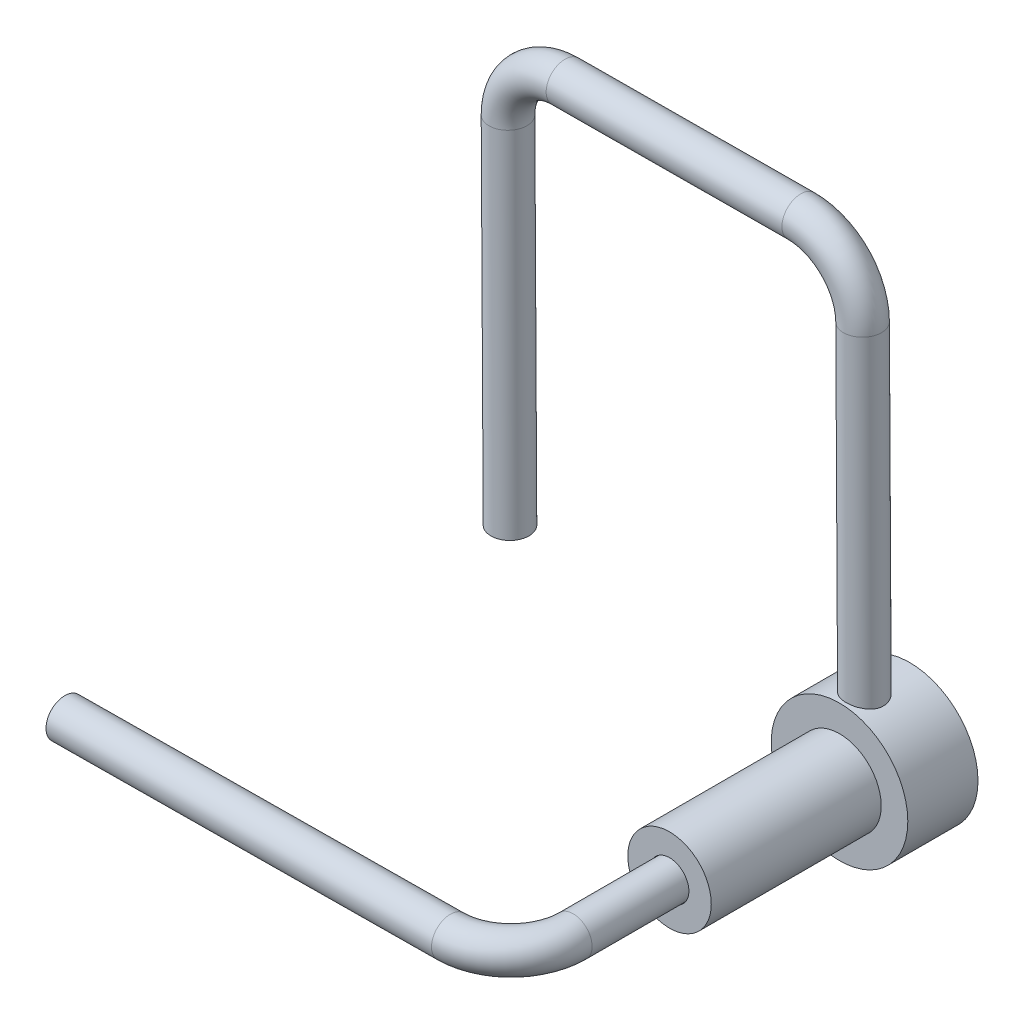
ISO-10303-21;
HEADER;
FILE_DESCRIPTION(('STEP AP214'),'2;1');
FILE_NAME('part.step','',(''),(''),'','','');
FILE_SCHEMA(('AUTOMOTIVE_DESIGN { 1 0 10303 214 1 1 1 1 }'));
ENDSEC;
DATA;
#1=APPLICATION_CONTEXT('core data for automotive mechanical design processes');
#2=APPLICATION_PROTOCOL_DEFINITION('international standard','automotive_design',2000,#1);
#3=PRODUCT_CONTEXT('',#1,'mechanical');
#4=PRODUCT('Part','Part','',(#3));
#5=PRODUCT_RELATED_PRODUCT_CATEGORY('part','',(#4));
#6=PRODUCT_DEFINITION_FORMATION('','',#4);
#7=PRODUCT_DEFINITION_CONTEXT('part definition',#1,'design');
#8=PRODUCT_DEFINITION('design','',#6,#7);
#9=PRODUCT_DEFINITION_SHAPE('','',#8);
#10=(LENGTH_UNIT() NAMED_UNIT(*) SI_UNIT(.MILLI.,.METRE.));
#11=(NAMED_UNIT(*) PLANE_ANGLE_UNIT() SI_UNIT($,.RADIAN.));
#12=(NAMED_UNIT(*) SI_UNIT($,.STERADIAN.) SOLID_ANGLE_UNIT());
#13=UNCERTAINTY_MEASURE_WITH_UNIT(LENGTH_MEASURE(1.E-05),#10,'distance_accuracy_value','');
#14=(GEOMETRIC_REPRESENTATION_CONTEXT(3) GLOBAL_UNCERTAINTY_ASSIGNED_CONTEXT((#13)) GLOBAL_UNIT_ASSIGNED_CONTEXT((#10,
#11,#12)) REPRESENTATION_CONTEXT('',''));
#15=CARTESIAN_POINT('',(0.,0.,0.));
#16=DIRECTION('',(0.,0.,1.));
#17=DIRECTION('',(1.,0.,0.));
#18=AXIS2_PLACEMENT_3D('',#15,#16,#17);
#19=CARTESIAN_POINT('',(0.,0.,0.));
#20=DIRECTION('',(0.,0.,1.));
#21=DIRECTION('',(1.,0.,0.));
#22=AXIS2_PLACEMENT_3D('',#19,#20,#21);
#23=PLANE('',#22);
#24=CARTESIAN_POINT('',(0.,0.,0.));
#25=DIRECTION('',(0.,0.,1.));
#26=DIRECTION('',(1.,0.,0.));
#27=AXIS2_PLACEMENT_3D('',#24,#25,#26);
#28=CIRCLE('',#27,2.55);
#29=CARTESIAN_POINT('',(2.55,0.,0.));
#30=VERTEX_POINT('',#29);
#31=EDGE_CURVE('E165',#30,#30,#28,.T.);
#32=ORIENTED_EDGE('',*,*,#31,.T.);
#33=EDGE_LOOP('',(#32));
#34=FACE_BOUND('',#33,.T.);
#35=CARTESIAN_POINT('',(0.,0.,0.));
#36=DIRECTION('',(0.,0.,1.));
#37=DIRECTION('',(1.,0.,0.));
#38=AXIS2_PLACEMENT_3D('',#35,#36,#37);
#39=CIRCLE('',#38,7.05);
#40=CARTESIAN_POINT('',(7.05,0.,0.));
#41=VERTEX_POINT('',#40);
#42=EDGE_CURVE('E13',#41,#41,#39,.T.);
#43=ORIENTED_EDGE('',*,*,#42,.F.);
#44=EDGE_LOOP('',(#43));
#45=FACE_BOUND('',#44,.T.);
#46=ADVANCED_FACE('F146',(#34,#45),#23,.F.);
#47=CARTESIAN_POINT('',(0.,0.,25.4));
#48=DIRECTION('',(0.,0.,-1.));
#49=DIRECTION('',(-1.,0.,0.));
#50=AXIS2_PLACEMENT_3D('',#47,#48,#49);
#51=CYLINDRICAL_SURFACE('',#50,2.55);
#52=CARTESIAN_POINT('',(0.,0.,25.4));
#53=DIRECTION('',(0.,0.,1.));
#54=DIRECTION('',(1.,0.,0.));
#55=AXIS2_PLACEMENT_3D('',#52,#53,#54);
#56=CIRCLE('',#55,2.55);
#57=CARTESIAN_POINT('',(2.55,0.,25.4));
#58=VERTEX_POINT('',#57);
#59=EDGE_CURVE('E159',#58,#58,#56,.T.);
#60=ORIENTED_EDGE('',*,*,#59,.T.);
#61=EDGE_LOOP('',(#60));
#62=FACE_BOUND('',#61,.T.);
#63=ORIENTED_EDGE('',*,*,#31,.F.);
#64=EDGE_LOOP('',(#63));
#65=FACE_BOUND('',#64,.T.);
#66=ADVANCED_FACE('F148',(#62,#65),#51,.F.);
#67=CARTESIAN_POINT('',(0.,0.,25.4));
#68=DIRECTION('',(0.,0.,-1.));
#69=DIRECTION('',(-1.,0.,0.));
#70=AXIS2_PLACEMENT_3D('',#67,#68,#69);
#71=CYLINDRICAL_SURFACE('',#70,5.5);
#72=CARTESIAN_POINT('',(0.,0.,3.));
#73=DIRECTION('',(0.,0.,1.));
#74=DIRECTION('',(1.,0.,0.));
#75=AXIS2_PLACEMENT_3D('',#72,#73,#74);
#76=CIRCLE('',#75,5.5);
#77=CARTESIAN_POINT('',(5.5,0.,3.));
#78=VERTEX_POINT('',#77);
#79=EDGE_CURVE('E175',#78,#78,#76,.T.);
#80=ORIENTED_EDGE('',*,*,#79,.T.);
#81=EDGE_LOOP('',(#80));
#82=FACE_BOUND('',#81,.T.);
#83=CARTESIAN_POINT('',(0.,0.,25.4));
#84=DIRECTION('',(0.,0.,1.));
#85=DIRECTION('',(1.,0.,0.));
#86=AXIS2_PLACEMENT_3D('',#83,#84,#85);
#87=CIRCLE('',#86,5.5);
#88=CARTESIAN_POINT('',(5.5,0.,25.4));
#89=VERTEX_POINT('',#88);
#90=EDGE_CURVE('E154',#89,#89,#87,.T.);
#91=ORIENTED_EDGE('',*,*,#90,.F.);
#92=EDGE_LOOP('',(#91));
#93=FACE_BOUND('',#92,.T.);
#94=ADVANCED_FACE('F211',(#82,#93),#71,.T.);
#95=CARTESIAN_POINT('',(0.,0.,25.4));
#96=DIRECTION('',(0.,0.,1.));
#97=DIRECTION('',(1.,0.,0.));
#98=AXIS2_PLACEMENT_3D('',#95,#96,#97);
#99=PLANE('',#98);
#100=ORIENTED_EDGE('',*,*,#59,.F.);
#101=EDGE_LOOP('',(#100));
#102=FACE_BOUND('',#101,.T.);
#103=ORIENTED_EDGE('',*,*,#90,.T.);
#104=EDGE_LOOP('',(#103));
#105=FACE_BOUND('',#104,.T.);
#106=ADVANCED_FACE('F215',(#102,#105),#99,.T.);
#107=CARTESIAN_POINT('',(0.,0.,3.));
#108=DIRECTION('',(0.,0.,-1.));
#109=DIRECTION('',(-1.,0.,0.));
#110=AXIS2_PLACEMENT_3D('',#107,#108,#109);
#111=CYLINDRICAL_SURFACE('',#110,9.);
#112=CARTESIAN_POINT('',(0.,0.,3.));
#113=DIRECTION('',(0.,0.,1.));
#114=DIRECTION('',(1.,0.,0.));
#115=AXIS2_PLACEMENT_3D('',#112,#113,#114);
#116=CIRCLE('',#115,9.);
#117=CARTESIAN_POINT('',(9.,0.,3.));
#118=VERTEX_POINT('',#117);
#119=EDGE_CURVE('E170',#118,#118,#116,.T.);
#120=ORIENTED_EDGE('',*,*,#119,.F.);
#121=EDGE_LOOP('',(#120));
#122=FACE_BOUND('',#121,.T.);
#123=CARTESIAN_POINT('',(0.,0.,-6.25));
#124=DIRECTION('',(0.,0.,1.));
#125=DIRECTION('',(1.,0.,0.));
#126=AXIS2_PLACEMENT_3D('',#123,#124,#125);
#127=CIRCLE('',#126,9.);
#128=CARTESIAN_POINT('',(9.,0.,-6.25));
#129=VERTEX_POINT('',#128);
#130=EDGE_CURVE('E180',#129,#129,#127,.T.);
#131=ORIENTED_EDGE('',*,*,#130,.T.);
#132=EDGE_LOOP('',(#131));
#133=FACE_BOUND('',#132,.T.);
#134=ADVANCED_FACE('F203',(#122,#133),#111,.T.);
#135=CARTESIAN_POINT('',(0.,0.,3.));
#136=DIRECTION('',(0.,0.,1.));
#137=DIRECTION('',(1.,0.,0.));
#138=AXIS2_PLACEMENT_3D('',#135,#136,#137);
#139=PLANE('',#138);
#140=ORIENTED_EDGE('',*,*,#79,.F.);
#141=EDGE_LOOP('',(#140));
#142=FACE_BOUND('',#141,.T.);
#143=ORIENTED_EDGE('',*,*,#119,.T.);
#144=EDGE_LOOP('',(#143));
#145=FACE_BOUND('',#144,.T.);
#146=ADVANCED_FACE('F196',(#142,#145),#139,.T.);
#147=CARTESIAN_POINT('',(0.,0.,-6.25));
#148=DIRECTION('',(0.,0.,1.));
#149=DIRECTION('',(1.,0.,0.));
#150=AXIS2_PLACEMENT_3D('',#147,#148,#149);
#151=CYLINDRICAL_SURFACE('',#150,7.05);
#152=CARTESIAN_POINT('',(0.,0.,-6.25));
#153=DIRECTION('',(0.,0.,1.));
#154=DIRECTION('',(1.,0.,0.));
#155=AXIS2_PLACEMENT_3D('',#152,#153,#154);
#156=CIRCLE('',#155,7.05);
#157=CARTESIAN_POINT('',(7.05,0.,-6.25));
#158=VERTEX_POINT('',#157);
#159=EDGE_CURVE('E186',#158,#158,#156,.T.);
#160=ORIENTED_EDGE('',*,*,#159,.F.);
#161=EDGE_LOOP('',(#160));
#162=FACE_BOUND('',#161,.T.);
#163=ORIENTED_EDGE('',*,*,#42,.T.);
#164=EDGE_LOOP('',(#163));
#165=FACE_BOUND('',#164,.T.);
#166=ADVANCED_FACE('F194',(#162,#165),#151,.F.);
#167=CARTESIAN_POINT('',(0.,0.,-6.25));
#168=DIRECTION('',(0.,0.,1.));
#169=DIRECTION('',(1.,0.,0.));
#170=AXIS2_PLACEMENT_3D('',#167,#168,#169);
#171=PLANE('',#170);
#172=ORIENTED_EDGE('',*,*,#159,.T.);
#173=EDGE_LOOP('',(#172));
#174=FACE_BOUND('',#173,.T.);
#175=ORIENTED_EDGE('',*,*,#130,.F.);
#176=EDGE_LOOP('',(#175));
#177=FACE_BOUND('',#176,.T.);
#178=ADVANCED_FACE('F191',(#174,#177),#171,.F.);
#179=CLOSED_SHELL('',(#46,#66,#94,#106,#134,#146,#166,#178));
#180=MANIFOLD_SOLID_BREP('B2',#179);
#181=CARTESIAN_POINT('',(0.,0.,101.6));
#182=DIRECTION('',(0.,0.,-1.));
#183=DIRECTION('',(-1.,0.,0.));
#184=AXIS2_PLACEMENT_3D('',#181,#182,#183);
#185=CYLINDRICAL_SURFACE('',#184,2.5);
#186=CARTESIAN_POINT('',(0.,0.,0.));
#187=DIRECTION('',(0.,0.,1.));
#188=DIRECTION('',(1.,0.,0.));
#189=AXIS2_PLACEMENT_3D('',#186,#187,#188);
#190=CIRCLE('',#189,2.5);
#191=CARTESIAN_POINT('',(2.5,0.,0.));
#192=VERTEX_POINT('',#191);
#193=EDGE_CURVE('E308',#192,#192,#190,.T.);
#194=ORIENTED_EDGE('',*,*,#193,.T.);
#195=EDGE_LOOP('',(#194));
#196=FACE_BOUND('',#195,.T.);
#197=CARTESIAN_POINT('',(0.,0.,38.1));
#198=DIRECTION('',(0.,0.,1.));
#199=DIRECTION('',(1.,0.,0.));
#200=AXIS2_PLACEMENT_3D('',#197,#198,#199);
#201=CIRCLE('',#200,2.5);
#202=CARTESIAN_POINT('',(2.49990480766043,0.0218163387459008,38.1));
#203=VERTEX_POINT('',#202);
#204=EDGE_CURVE('E303',#203,#203,#201,.T.);
#205=ORIENTED_EDGE('',*,*,#204,.F.);
#206=EDGE_LOOP('',(#205));
#207=FACE_BOUND('',#206,.T.);
#208=ADVANCED_FACE('F295',(#196,#207),#185,.T.);
#209=CARTESIAN_POINT('',(-8.08476325433448,-0.0705546600400517,38.1));
#210=DIRECTION('',(0.00872653549836032,-0.999961923064171,0.));
#211=DIRECTION('',(0.999961923064171,0.00872653549836032,0.));
#212=AXIS2_PLACEMENT_3D('',#209,#210,#211);
#213=TOROIDAL_SURFACE('',#212,8.08507110906827,2.5);
#214=CARTESIAN_POINT('',(-8.08476325433451,-0.0705546600400519,46.1850711090683));
#215=DIRECTION('',(-0.999961923064171,-0.00872653549836032,0.));
#216=DIRECTION('',(7.61524218006515E-05,-0.00872620321862817,0.999961923064171));
#217=AXIS2_PLACEMENT_3D('',#214,#215,#216);
#218=CIRCLE('',#217,2.5);
#219=CARTESIAN_POINT('',(-8.08476325433451,-0.070554660040052,48.6850711090683));
#220=VERTEX_POINT('',#219);
#221=EDGE_CURVE('E145',#220,#220,#218,.T.);
#222=CARTESIAN_POINT('',(-8.08476325433448,-0.0705546600400517,38.1));
#223=DIRECTION('',(0.00872653549836032,-0.999961923064171,0.));
#224=DIRECTION('',(0.999961923064171,0.00872653549836032,0.));
#225=AXIS2_PLACEMENT_3D('',#222,#223,#224);
#226=CIRCLE('',#225,10.5850711090683);
#227=EDGE_CURVE('',#203,#220,#226,.T.);
#228=ORIENTED_EDGE('',*,*,#204,.T.);
#229=ORIENTED_EDGE('',*,*,#221,.F.);
#230=ORIENTED_EDGE('',*,*,#227,.T.);
#231=ORIENTED_EDGE('',*,*,#227,.F.);
#232=EDGE_LOOP('',(#228,#230,#229,#231));
#233=FACE_BOUND('',#232,.T.);
#234=ADVANCED_FACE('F328',(#233),#213,.T.);
#235=CARTESIAN_POINT('',(-58.8828289459944,-0.513862663356756,46.1850711090681));
#236=DIRECTION('',(0.999961923064171,0.00872653549836032,0.));
#237=DIRECTION('',(-7.61524218006515E-05,0.00872620321862817,-0.999961923064171));
#238=AXIS2_PLACEMENT_3D('',#235,#236,#237);
#239=CYLINDRICAL_SURFACE('',#238,2.5);
#240=ORIENTED_EDGE('',*,*,#221,.T.);
#241=EDGE_LOOP('',(#240));
#242=FACE_BOUND('',#241,.T.);
#243=CARTESIAN_POINT('',(-58.8828289459944,-0.513862663356756,46.1850711090681));
#244=DIRECTION('',(-0.999961923064171,-0.00872653549836032,0.));
#245=DIRECTION('',(7.61524218006515E-05,-0.00872620321862817,0.999961923064171));
#246=AXIS2_PLACEMENT_3D('',#243,#244,#245);
#247=CIRCLE('',#246,2.5);
#248=CARTESIAN_POINT('',(-58.8826385649399,-0.535678171403326,48.6849759167285));
#249=VERTEX_POINT('',#248);
#250=EDGE_CURVE('E311',#249,#249,#247,.T.);
#251=ORIENTED_EDGE('',*,*,#250,.F.);
#252=EDGE_LOOP('',(#251));
#253=FACE_BOUND('',#252,.T.);
#254=ADVANCED_FACE('F325',(#242,#253),#239,.T.);
#255=CARTESIAN_POINT('',(-58.8828289459944,-0.513862663356756,46.1850711090681));
#256=DIRECTION('',(-0.999961923064171,-0.00872653549836032,0.));
#257=DIRECTION('',(7.61524218006515E-05,-0.00872620321862817,0.999961923064171));
#258=AXIS2_PLACEMENT_3D('',#255,#256,#257);
#259=PLANE('',#258);
#260=ORIENTED_EDGE('',*,*,#250,.T.);
#261=EDGE_LOOP('',(#260));
#262=FACE_BOUND('',#261,.T.);
#263=ADVANCED_FACE('F321',(#262),#259,.T.);
#264=CARTESIAN_POINT('',(0.,0.,0.));
#265=DIRECTION('',(0.,0.,1.));
#266=DIRECTION('',(1.,0.,0.));
#267=AXIS2_PLACEMENT_3D('',#264,#265,#266);
#268=PLANE('',#267);
#269=ORIENTED_EDGE('',*,*,#193,.F.);
#270=EDGE_LOOP('',(#269));
#271=FACE_BOUND('',#270,.T.);
#272=ADVANCED_FACE('F297',(#271),#268,.F.);
#273=CLOSED_SHELL('',(#208,#234,#254,#263,#272));
#274=MANIFOLD_SOLID_BREP('B8_NOT_SHOWN',#273);
#275=CARTESIAN_POINT('',(-46.420753356991,4.59161939468769,-1.76544371842712E-13));
#276=DIRECTION('',(-0.00563734568943531,0.999984110040543,0.));
#277=DIRECTION('',(0.,0.,-1.));
#278=AXIS2_PLACEMENT_3D('',#275,#276,#277);
#279=CYLINDRICAL_SURFACE('',#278,2.5);
#280=CARTESIAN_POINT('',(-46.6839243014587,51.2743628683252,0.));
#281=DIRECTION('',(-0.00563734568943116,0.999984110040544,0.));
#282=DIRECTION('',(0.,0.,-1.));
#283=AXIS2_PLACEMENT_3D('',#280,#281,#282);
#284=CIRCLE('',#283,2.5);
#285=CARTESIAN_POINT('',(-46.6839243014588,51.2743628683252,-2.50000000000001));
#286=VERTEX_POINT('',#285);
#287=EDGE_CURVE('E294',#286,#286,#284,.T.);
#288=ORIENTED_EDGE('',*,*,#287,.F.);
#289=EDGE_LOOP('',(#288));
#290=FACE_BOUND('',#289,.T.);
#291=CARTESIAN_POINT('',(-46.420753356991,4.59161939468769,-1.76544371842712E-13));
#292=DIRECTION('',(0.00563734568943531,-0.999984110040544,0.));
#293=DIRECTION('',(0.,0.,1.));
#294=AXIS2_PLACEMENT_3D('',#291,#292,#293);
#295=CIRCLE('',#294,2.5);
#296=CARTESIAN_POINT('',(-46.420753356991,4.59161939468768,2.49999999999982));
#297=VERTEX_POINT('',#296);
#298=EDGE_CURVE('E397',#297,#297,#295,.T.);
#299=ORIENTED_EDGE('',*,*,#298,.F.);
#300=EDGE_LOOP('',(#299));
#301=FACE_BOUND('',#300,.T.);
#302=ADVANCED_FACE('F369',(#290,#301),#279,.T.);
#303=CARTESIAN_POINT('',(-8.04265016746616,50.9751657825808,0.));
#304=DIRECTION('',(0.,0.,1.));
#305=DIRECTION('',(0.999984110040544,0.00563734568942783,0.));
#306=AXIS2_PLACEMENT_3D('',#303,#304,#305);
#307=TOROIDAL_SURFACE('',#306,8.08507110906829,2.5);
#308=CARTESIAN_POINT('',(-8.08822850823162,59.0601084201969,0.));
#309=DIRECTION('',(-0.999984110040544,-0.00563734568943199,0.));
#310=DIRECTION('',(0.,0.,1.));
#311=AXIS2_PLACEMENT_3D('',#308,#309,#310);
#312=CIRCLE('',#311,2.5);
#313=CARTESIAN_POINT('',(-8.08822850823162,59.0601084201969,2.5));
#314=VERTEX_POINT('',#313);
#315=EDGE_CURVE('E382',#314,#314,#312,.T.);
#316=ORIENTED_EDGE('',*,*,#315,.F.);
#317=EDGE_LOOP('',(#316));
#318=FACE_BOUND('',#317,.T.);
#319=CARTESIAN_POINT('',(0.0422924701500044,51.0207441233462,0.));
#320=DIRECTION('',(-0.00563734568942783,0.999984110040544,0.));
#321=DIRECTION('',(0.,0.,1.));
#322=AXIS2_PLACEMENT_3D('',#319,#320,#321);
#323=CIRCLE('',#322,2.5);
#324=CARTESIAN_POINT('',(0.0422924701500042,51.0207441233462,-2.5));
#325=VERTEX_POINT('',#324);
#326=EDGE_CURVE('E394',#325,#325,#323,.T.);
#327=ORIENTED_EDGE('',*,*,#326,.T.);
#328=EDGE_LOOP('',(#327));
#329=FACE_BOUND('',#328,.T.);
#330=ADVANCED_FACE('F409',(#318,#329),#307,.T.);
#331=CARTESIAN_POINT('',(-0.530461851895863,152.619129703465,0.));
#332=DIRECTION('',(0.00563734568942783,-0.999984110040543,0.));
#333=DIRECTION('',(0.,0.,-1.));
#334=AXIS2_PLACEMENT_3D('',#331,#332,#333);
#335=CYLINDRICAL_SURFACE('',#334,2.5);
#336=CARTESIAN_POINT('',(0.328669631172938,0.221551333286567,0.));
#337=DIRECTION('',(-0.00563734568942783,0.999984110040544,0.));
#338=DIRECTION('',(0.,0.,1.));
#339=AXIS2_PLACEMENT_3D('',#336,#337,#338);
#340=CIRCLE('',#339,2.5);
#341=CARTESIAN_POINT('',(0.328669631172938,0.221551333286552,-2.5));
#342=VERTEX_POINT('',#341);
#343=EDGE_CURVE('E391',#342,#342,#340,.T.);
#344=CARTESIAN_POINT('',(0.328669631172938,0.221551333286552,-2.5));
#345=CARTESIAN_POINT('',(0.325686535745616,0.750709591516342,-2.5));
#346=CARTESIAN_POINT('',(0.322703440318294,1.27986784974613,-2.5));
#347=CARTESIAN_POINT('',(0.316737249463649,2.33818436620572,-2.5));
#348=CARTESIAN_POINT('',(0.313754154036327,2.86734262443551,-2.5));
#349=CARTESIAN_POINT('',(0.307787963181683,3.92565914089508,-2.5));
#350=CARTESIAN_POINT('',(0.30480486775436,4.45481739912486,-2.5));
#351=CARTESIAN_POINT('',(0.298838676899716,5.51313391558444,-2.5));
#352=CARTESIAN_POINT('',(0.295855581472394,6.04229217381423,-2.5));
#353=CARTESIAN_POINT('',(0.289889390617749,7.10060869027381,-2.5));
#354=CARTESIAN_POINT('',(0.286906295190427,7.6297669485036,-2.5));
#355=CARTESIAN_POINT('',(0.280940104335783,8.68808346496317,-2.5));
#356=CARTESIAN_POINT('',(0.27795700890846,9.21724172319296,-2.5));
#357=CARTESIAN_POINT('',(0.271990818053816,10.2755582396525,-2.5));
#358=CARTESIAN_POINT('',(0.269007722626494,10.8047164978823,-2.5));
#359=CARTESIAN_POINT('',(0.263041531771849,11.8630330143419,-2.5));
#360=CARTESIAN_POINT('',(0.260058436344527,12.3921912725717,-2.5));
#361=CARTESIAN_POINT('',(0.254092245489882,13.4505077890313,-2.5));
#362=CARTESIAN_POINT('',(0.25110915006256,13.979666047261,-2.5));
#363=CARTESIAN_POINT('',(0.245142959207916,15.0379825637206,-2.5));
#364=CARTESIAN_POINT('',(0.242159863780594,15.5671408219504,-2.5));
#365=CARTESIAN_POINT('',(0.236193672925949,16.62545733841,-2.5));
#366=CARTESIAN_POINT('',(0.233210577498627,17.1546155966398,-2.5));
#367=CARTESIAN_POINT('',(0.227244386643982,18.2129321130994,-2.5));
#368=CARTESIAN_POINT('',(0.22426129121666,18.7420903713291,-2.5));
#369=CARTESIAN_POINT('',(0.218295100362016,19.8004068877887,-2.5));
#370=CARTESIAN_POINT('',(0.215312004934693,20.3295651460185,-2.5));
#371=CARTESIAN_POINT('',(0.209345814080049,21.3878816624781,-2.5));
#372=CARTESIAN_POINT('',(0.206362718652727,21.9170399207079,-2.5));
#373=CARTESIAN_POINT('',(0.200396527798082,22.9753564371675,-2.5));
#374=CARTESIAN_POINT('',(0.19741343237076,23.5045146953972,-2.5));
#375=CARTESIAN_POINT('',(0.191447241516116,24.5628312118568,-2.5));
#376=CARTESIAN_POINT('',(0.188464146088793,25.0919894700866,-2.5));
#377=CARTESIAN_POINT('',(0.182497955234149,26.1503059865462,-2.5));
#378=CARTESIAN_POINT('',(0.179514859806827,26.679464244776,-2.5));
#379=CARTESIAN_POINT('',(0.173548668952182,27.7377807612355,-2.5));
#380=CARTESIAN_POINT('',(0.17056557352486,28.2669390194653,-2.5));
#381=CARTESIAN_POINT('',(0.164599382670216,29.3252555359249,-2.5));
#382=CARTESIAN_POINT('',(0.161616287242893,29.8544137941547,-2.5));
#383=CARTESIAN_POINT('',(0.155650096388249,30.9127303106143,-2.5));
#384=CARTESIAN_POINT('',(0.152667000960927,31.441888568844,-2.5));
#385=CARTESIAN_POINT('',(0.146700810106282,32.5002050853036,-2.5));
#386=CARTESIAN_POINT('',(0.14371771467896,33.0293633435334,-2.5));
#387=CARTESIAN_POINT('',(0.137751523824316,34.087679859993,-2.5));
#388=CARTESIAN_POINT('',(0.134768428396993,34.6168381182228,-2.5));
#389=CARTESIAN_POINT('',(0.128802237542349,35.6751546346824,-2.5));
#390=CARTESIAN_POINT('',(0.125819142115027,36.2043128929121,-2.5));
#391=CARTESIAN_POINT('',(0.119852951260382,37.2626294093717,-2.5));
#392=CARTESIAN_POINT('',(0.11686985583306,37.7917876676015,-2.5));
#393=CARTESIAN_POINT('',(0.110903664978415,38.8501041840611,-2.5));
#394=CARTESIAN_POINT('',(0.107920569551093,39.3792624422909,-2.5));
#395=CARTESIAN_POINT('',(0.101954378696449,40.4375789587504,-2.5));
#396=CARTESIAN_POINT('',(0.0989712832691266,40.9667372169802,-2.5));
#397=CARTESIAN_POINT('',(0.0930050924144822,42.0250537334398,-2.5));
#398=CARTESIAN_POINT('',(0.09002199698716,42.5542119916696,-2.5));
#399=CARTESIAN_POINT('',(0.0840558061325155,43.6125285081292,-2.5));
#400=CARTESIAN_POINT('',(0.0810727107051932,44.141686766359,-2.5));
#401=CARTESIAN_POINT('',(0.0751065198505488,45.2000032828185,-2.5));
#402=CARTESIAN_POINT('',(0.0721234244232265,45.7291615410483,-2.5));
#403=CARTESIAN_POINT('',(0.0661572335685821,46.7874780575079,-2.5));
#404=CARTESIAN_POINT('',(0.0631741381412599,47.3166363157377,-2.5));
#405=CARTESIAN_POINT('',(0.0572079472866154,48.3749528321973,-2.5));
#406=CARTESIAN_POINT('',(0.0542248518592931,48.9041110904271,-2.5));
#407=CARTESIAN_POINT('',(0.0482586610046486,49.9624276068866,-2.5));
#408=CARTESIAN_POINT('',(0.0452755655773264,50.4915858651164,-2.5));
#409=CARTESIAN_POINT('',(0.0422924701500042,51.0207441233462,-2.5));
#410=B_SPLINE_CURVE_WITH_KNOTS('',3,(#344,#345,#346,#347,#348,#349,#350,#351,#352,#353,#354,
#355,#356,#357,#358,#359,#360,#361,#362,#363,#364,#365,#366,#367,#368,#369,#370,#371,#372,#373,
#374,#375,#376,#377,#378,#379,#380,#381,#382,#383,#384,#385,#386,#387,#388,#389,#390,#391,#392,
#393,#394,#395,#396,#397,#398,#399,#400,#401,#402,#403,#404,#405,#406,#407,#408,#409),
.UNSPECIFIED.,.F.,.F.,(4,2,2,2,2,2,2,2,2,2,2,2,2,2,2,2,2,2,2,2,2,2,2,2,2,2,2,2,2,2,2,2,4),(0.,
1.58750000000001,3.17500000000002,4.7625,6.35000000000002,7.93750000000003,9.52500000000001,
11.1125,12.7,14.2875,15.875,17.4625,19.05,20.6375,22.225,23.8125,25.4,26.9875000000001,28.575,
30.1625,31.75,33.3375,34.925,36.5125000000001,38.1000000000001,39.6875000000001,
41.2750000000001,42.8625000000001,44.4500000000001,46.0375000000001,47.6250000000001,
49.2125000000001,50.8000000000001),.UNSPECIFIED.);
#411=EDGE_CURVE('BSEAM415',#342,#325,#410,.T.);
#412=ORIENTED_EDGE('',*,*,#343,.T.);
#413=ORIENTED_EDGE('',*,*,#326,.F.);
#414=ORIENTED_EDGE('',*,*,#411,.T.);
#415=ORIENTED_EDGE('',*,*,#411,.F.);
#416=EDGE_LOOP('',(#412,#414,#413,#415));
#417=FACE_BOUND('',#416,.T.);
#418=ADVANCED_FACE('F415',(#417),#335,.T.);
#419=CARTESIAN_POINT('',(-39.116,51.3170265516882,-2.02048781873498E-13));
#420=DIRECTION('',(0.,0.,-1.));
#421=DIRECTION('',(0.,1.,0.));
#422=AXIS2_PLACEMENT_3D('',#419,#420,#421);
#423=TOROIDAL_SURFACE('',#422,7.56804455737974,2.5);
#424=CARTESIAN_POINT('',(-39.1586636833629,58.884950853147,0.));
#425=DIRECTION('',(0.999984110040544,0.00563734568942783,0.));
#426=DIRECTION('',(0.,0.,-1.));
#427=AXIS2_PLACEMENT_3D('',#424,#425,#426);
#428=CIRCLE('',#427,2.5);
#429=CARTESIAN_POINT('',(-39.1586636833629,58.884950853147,-2.5));
#430=VERTEX_POINT('',#429);
#431=EDGE_CURVE('E377',#430,#430,#428,.T.);
#432=ORIENTED_EDGE('',*,*,#431,.F.);
#433=EDGE_LOOP('',(#432));
#434=FACE_BOUND('',#433,.T.);
#435=ORIENTED_EDGE('',*,*,#287,.T.);
#436=EDGE_LOOP('',(#435));
#437=FACE_BOUND('',#436,.T.);
#438=ADVANCED_FACE('F421',(#434,#437),#423,.T.);
#439=CARTESIAN_POINT('',(-96.9868158908359,58.5589483884064,0.));
#440=DIRECTION('',(0.999984110040543,0.00563734568943199,0.));
#441=DIRECTION('',(0.,0.,-1.));
#442=AXIS2_PLACEMENT_3D('',#439,#440,#441);
#443=CYLINDRICAL_SURFACE('',#442,2.5);
#444=ORIENTED_EDGE('',*,*,#315,.T.);
#445=EDGE_LOOP('',(#444));
#446=FACE_BOUND('',#445,.T.);
#447=ORIENTED_EDGE('',*,*,#431,.T.);
#448=EDGE_LOOP('',(#447));
#449=FACE_BOUND('',#448,.T.);
#450=ADVANCED_FACE('F425',(#446,#449),#443,.T.);
#451=CARTESIAN_POINT('',(-46.420753356991,4.59161939468769,-1.76544371842712E-13));
#452=DIRECTION('',(0.00563734568943531,-0.999984110040544,0.));
#453=DIRECTION('',(0.,0.,1.));
#454=AXIS2_PLACEMENT_3D('',#451,#452,#453);
#455=PLANE('',#454);
#456=ORIENTED_EDGE('',*,*,#298,.T.);
#457=EDGE_LOOP('',(#456));
#458=FACE_BOUND('',#457,.T.);
#459=ADVANCED_FACE('F406',(#458),#455,.T.);
#460=CARTESIAN_POINT('',(0.328669631172938,0.221551333286567,0.));
#461=DIRECTION('',(-0.00563734568942783,0.999984110040544,0.));
#462=DIRECTION('',(0.,0.,1.));
#463=AXIS2_PLACEMENT_3D('',#460,#461,#462);
#464=PLANE('',#463);
#465=ORIENTED_EDGE('',*,*,#343,.F.);
#466=EDGE_LOOP('',(#465));
#467=FACE_BOUND('',#466,.T.);
#468=ADVANCED_FACE('F371',(#467),#464,.F.);
#469=CLOSED_SHELL('',(#302,#330,#418,#438,#450,#459,#468));
#470=MANIFOLD_SOLID_BREP('B140_NOT_SHOWN',#469);
#471=ADVANCED_BREP_SHAPE_REPRESENTATION('',(#18,#180,#274,#470),#14);
#472=SHAPE_DEFINITION_REPRESENTATION(#9,#471);
ENDSEC;
END-ISO-10303-21;
